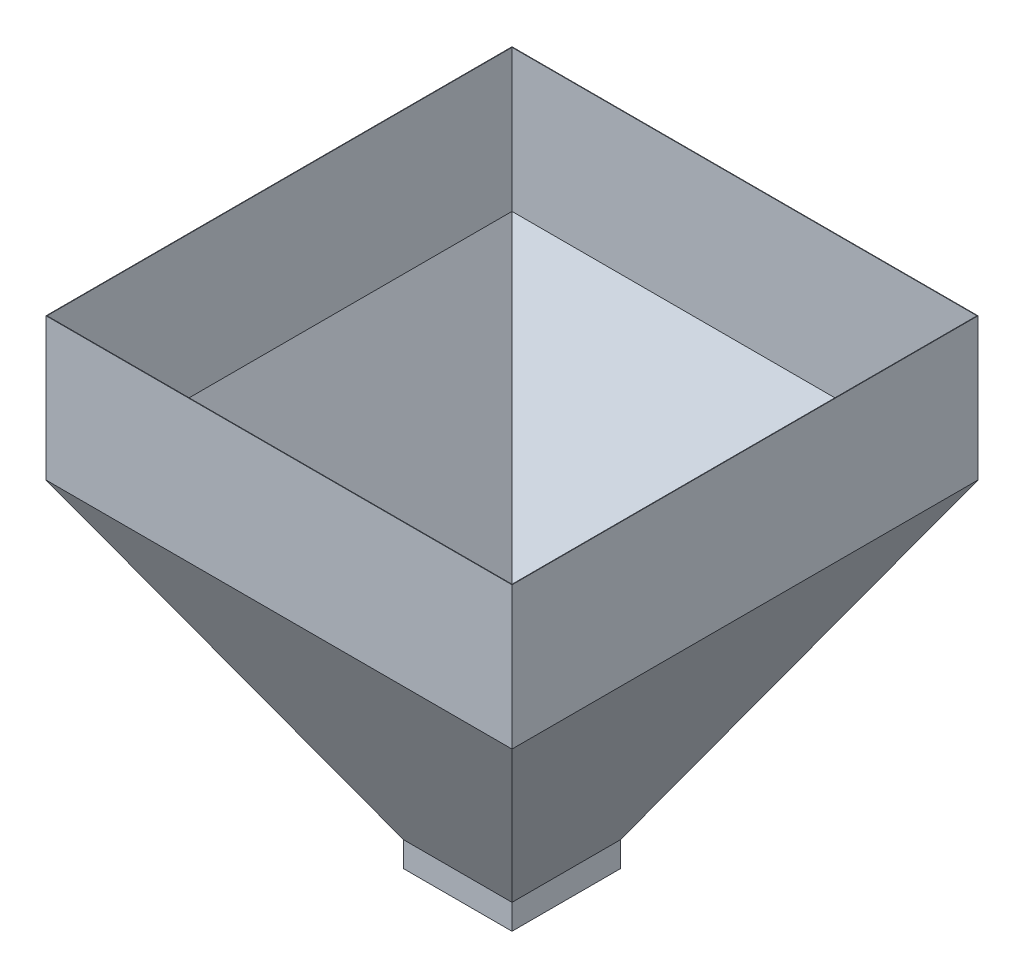
ISO-10303-21;
HEADER;
FILE_DESCRIPTION(('STEP AP214'),'2;1');
FILE_NAME('part.step','',(''),(''),'','','');
FILE_SCHEMA(('AUTOMOTIVE_DESIGN { 1 0 10303 214 1 1 1 1 }'));
ENDSEC;
DATA;
#1=APPLICATION_CONTEXT('core data for automotive mechanical design processes');
#2=APPLICATION_PROTOCOL_DEFINITION('international standard','automotive_design',2000,#1);
#3=PRODUCT_CONTEXT('',#1,'mechanical');
#4=PRODUCT('Part','Part','',(#3));
#5=PRODUCT_RELATED_PRODUCT_CATEGORY('part','',(#4));
#6=PRODUCT_DEFINITION_FORMATION('','',#4);
#7=PRODUCT_DEFINITION_CONTEXT('part definition',#1,'design');
#8=PRODUCT_DEFINITION('design','',#6,#7);
#9=PRODUCT_DEFINITION_SHAPE('','',#8);
#10=(LENGTH_UNIT() NAMED_UNIT(*) SI_UNIT(.MILLI.,.METRE.));
#11=(NAMED_UNIT(*) PLANE_ANGLE_UNIT() SI_UNIT($,.RADIAN.));
#12=(NAMED_UNIT(*) SI_UNIT($,.STERADIAN.) SOLID_ANGLE_UNIT());
#13=UNCERTAINTY_MEASURE_WITH_UNIT(LENGTH_MEASURE(1.E-05),#10,'distance_accuracy_value','');
#14=(GEOMETRIC_REPRESENTATION_CONTEXT(3) GLOBAL_UNCERTAINTY_ASSIGNED_CONTEXT((#13)) GLOBAL_UNIT_ASSIGNED_CONTEXT((#10,
#11,#12)) REPRESENTATION_CONTEXT('',''));
#15=CARTESIAN_POINT('',(0.,0.,0.));
#16=DIRECTION('',(0.,0.,1.));
#17=DIRECTION('',(1.,0.,0.));
#18=AXIS2_PLACEMENT_3D('',#15,#16,#17);
#19=CARTESIAN_POINT('',(-2.0200090675866E-13,-148.510323644844,-258.767988169046));
#20=DIRECTION('',(0.,-0.497762469710978,-0.867313394193372));
#21=DIRECTION('',(0.,0.867313394193372,-0.497762469710978));
#22=AXIS2_PLACEMENT_3D('',#19,#20,#21);
#23=PLANE('',#22);
#24=DIRECTION('',(-0.445610399726942,-0.776442363160582,0.445610399726943));
#25=VECTOR('',#24,1.);
#26=CARTESIAN_POINT('',(344.,0.,-344.));
#27=LINE('',#26,#25);
#28=CARTESIAN_POINT('',(344.,0.,-344.));
#29=VERTEX_POINT('',#28);
#30=CARTESIAN_POINT('',(80.0000000000002,-460.,-80.));
#31=VERTEX_POINT('',#30);
#32=EDGE_CURVE('E276',#29,#31,#27,.T.);
#33=ORIENTED_EDGE('',*,*,#32,.T.);
#34=DIRECTION('',(-1.,0.,0.));
#35=VECTOR('',#34,1.);
#36=CARTESIAN_POINT('',(-80.0000000000001,-460.,-80.));
#37=LINE('',#36,#35);
#38=CARTESIAN_POINT('',(-80.0000000000001,-460.,-80.));
#39=VERTEX_POINT('',#38);
#40=EDGE_CURVE('E12',#31,#39,#37,.T.);
#41=ORIENTED_EDGE('',*,*,#40,.T.);
#42=DIRECTION('',(0.445610399726943,-0.776442363160582,0.445610399726943));
#43=VECTOR('',#42,1.);
#44=CARTESIAN_POINT('',(-344.,0.,-344.));
#45=LINE('',#44,#43);
#46=CARTESIAN_POINT('',(-344.,0.,-344.));
#47=VERTEX_POINT('',#46);
#48=EDGE_CURVE('E338',#47,#39,#45,.T.);
#49=ORIENTED_EDGE('',*,*,#48,.F.);
#50=DIRECTION('',(-1.,0.,0.));
#51=VECTOR('',#50,1.);
#52=CARTESIAN_POINT('',(-344.,0.,-344.));
#53=LINE('',#52,#51);
#54=EDGE_CURVE('E270',#29,#47,#53,.T.);
#55=ORIENTED_EDGE('',*,*,#54,.F.);
#56=EDGE_LOOP('',(#33,#41,#49,#55));
#57=FACE_BOUND('',#56,.T.);
#58=ADVANCED_FACE('F43',(#57),#23,.T.);
#59=CARTESIAN_POINT('',(-258.767988169046,-148.510323644844,2.46889997149473E-13));
#60=DIRECTION('',(-0.867313394193372,-0.497762469710978,0.));
#61=DIRECTION('',(0.497762469710979,-0.867313394193372,0.));
#62=AXIS2_PLACEMENT_3D('',#59,#60,#61);
#63=PLANE('',#62);
#64=ORIENTED_EDGE('',*,*,#48,.T.);
#65=DIRECTION('',(0.,0.,1.));
#66=VECTOR('',#65,1.);
#67=CARTESIAN_POINT('',(-80.0000000000001,-460.,-80.));
#68=LINE('',#67,#66);
#69=CARTESIAN_POINT('',(-80.0000000000001,-460.,80.));
#70=VERTEX_POINT('',#69);
#71=EDGE_CURVE('E48',#39,#70,#68,.T.);
#72=ORIENTED_EDGE('',*,*,#71,.T.);
#73=DIRECTION('',(0.445610399726943,-0.776442363160582,-0.445610399726942));
#74=VECTOR('',#73,1.);
#75=CARTESIAN_POINT('',(-344.,0.,344.));
#76=LINE('',#75,#74);
#77=CARTESIAN_POINT('',(-344.,0.,344.));
#78=VERTEX_POINT('',#77);
#79=EDGE_CURVE('E337',#78,#70,#76,.T.);
#80=ORIENTED_EDGE('',*,*,#79,.F.);
#81=DIRECTION('',(0.,0.,1.));
#82=VECTOR('',#81,1.);
#83=CARTESIAN_POINT('',(-344.,0.,-344.));
#84=LINE('',#83,#82);
#85=EDGE_CURVE('E361',#47,#78,#84,.T.);
#86=ORIENTED_EDGE('',*,*,#85,.F.);
#87=EDGE_LOOP('',(#64,#72,#80,#86));
#88=FACE_BOUND('',#87,.T.);
#89=ADVANCED_FACE('F287',(#88),#63,.T.);
#90=CARTESIAN_POINT('',(258.767988169046,-148.510323644844,0.));
#91=DIRECTION('',(0.867313394193372,-0.497762469710978,0.));
#92=DIRECTION('',(0.497762469710978,0.867313394193372,0.));
#93=AXIS2_PLACEMENT_3D('',#90,#91,#92);
#94=PLANE('',#93);
#95=DIRECTION('',(-0.445610399726942,-0.776442363160582,-0.445610399726943));
#96=VECTOR('',#95,1.);
#97=CARTESIAN_POINT('',(344.,0.,344.));
#98=LINE('',#97,#96);
#99=CARTESIAN_POINT('',(344.,0.,344.));
#100=VERTEX_POINT('',#99);
#101=CARTESIAN_POINT('',(80.0000000000002,-460.,80.));
#102=VERTEX_POINT('',#101);
#103=EDGE_CURVE('E330',#100,#102,#98,.T.);
#104=ORIENTED_EDGE('',*,*,#103,.T.);
#105=DIRECTION('',(0.,0.,-1.));
#106=VECTOR('',#105,1.);
#107=CARTESIAN_POINT('',(80.0000000000001,-460.,-80.0000000000002));
#108=LINE('',#107,#106);
#109=EDGE_CURVE('E308',#102,#31,#108,.T.);
#110=ORIENTED_EDGE('',*,*,#109,.T.);
#111=ORIENTED_EDGE('',*,*,#32,.F.);
#112=DIRECTION('',(0.,0.,-1.));
#113=VECTOR('',#112,1.);
#114=CARTESIAN_POINT('',(344.,0.,-344.));
#115=LINE('',#114,#113);
#116=EDGE_CURVE('E408',#100,#29,#115,.T.);
#117=ORIENTED_EDGE('',*,*,#116,.F.);
#118=EDGE_LOOP('',(#104,#110,#111,#117));
#119=FACE_BOUND('',#118,.T.);
#120=ADVANCED_FACE('F314',(#119),#94,.T.);
#121=CARTESIAN_POINT('',(0.,-148.510323644844,258.767988169046));
#122=DIRECTION('',(0.,-0.497762469710978,0.867313394193372));
#123=DIRECTION('',(0.,-0.867313394193372,-0.497762469710978));
#124=AXIS2_PLACEMENT_3D('',#121,#122,#123);
#125=PLANE('',#124);
#126=ORIENTED_EDGE('',*,*,#79,.T.);
#127=DIRECTION('',(1.,0.,0.));
#128=VECTOR('',#127,1.);
#129=CARTESIAN_POINT('',(-80.,-460.,80.));
#130=LINE('',#129,#128);
#131=EDGE_CURVE('E480',#70,#102,#130,.T.);
#132=ORIENTED_EDGE('',*,*,#131,.T.);
#133=ORIENTED_EDGE('',*,*,#103,.F.);
#134=DIRECTION('',(1.,0.,0.));
#135=VECTOR('',#134,1.);
#136=CARTESIAN_POINT('',(-344.,0.,344.));
#137=LINE('',#136,#135);
#138=EDGE_CURVE('E345',#78,#100,#137,.T.);
#139=ORIENTED_EDGE('',*,*,#138,.F.);
#140=EDGE_LOOP('',(#126,#132,#133,#139));
#141=FACE_BOUND('',#140,.T.);
#142=ADVANCED_FACE('F45',(#141),#125,.T.);
#143=CARTESIAN_POINT('',(-344.,210.,-344.));
#144=DIRECTION('',(1.,0.,0.));
#145=DIRECTION('',(0.,0.,-1.));
#146=AXIS2_PLACEMENT_3D('',#143,#144,#145);
#147=PLANE('',#146);
#148=ORIENTED_EDGE('',*,*,#85,.T.);
#149=DIRECTION('',(0.,-1.,0.));
#150=VECTOR('',#149,1.);
#151=CARTESIAN_POINT('',(-344.,210.,344.));
#152=LINE('',#151,#150);
#153=CARTESIAN_POINT('',(-344.,210.,344.));
#154=VERTEX_POINT('',#153);
#155=EDGE_CURVE('E412',#154,#78,#152,.T.);
#156=ORIENTED_EDGE('',*,*,#155,.F.);
#157=DIRECTION('',(0.,0.,1.));
#158=VECTOR('',#157,1.);
#159=CARTESIAN_POINT('',(-344.,210.,-344.));
#160=LINE('',#159,#158);
#161=CARTESIAN_POINT('',(-344.,210.,-344.));
#162=VERTEX_POINT('',#161);
#163=EDGE_CURVE('E243',#162,#154,#160,.T.);
#164=ORIENTED_EDGE('',*,*,#163,.F.);
#165=DIRECTION('',(0.,-1.,0.));
#166=VECTOR('',#165,1.);
#167=CARTESIAN_POINT('',(-344.,210.,-344.));
#168=LINE('',#167,#166);
#169=EDGE_CURVE('E263',#162,#47,#168,.T.);
#170=ORIENTED_EDGE('',*,*,#169,.T.);
#171=EDGE_LOOP('',(#148,#156,#164,#170));
#172=FACE_BOUND('',#171,.T.);
#173=ADVANCED_FACE('F288',(#172),#147,.F.);
#174=CARTESIAN_POINT('',(-344.,210.,344.));
#175=DIRECTION('',(0.,0.,-1.));
#176=DIRECTION('',(-1.,0.,0.));
#177=AXIS2_PLACEMENT_3D('',#174,#175,#176);
#178=PLANE('',#177);
#179=ORIENTED_EDGE('',*,*,#138,.T.);
#180=DIRECTION('',(0.,-1.,0.));
#181=VECTOR('',#180,1.);
#182=CARTESIAN_POINT('',(344.,210.,344.));
#183=LINE('',#182,#181);
#184=CARTESIAN_POINT('',(344.,210.,344.));
#185=VERTEX_POINT('',#184);
#186=EDGE_CURVE('E390',#185,#100,#183,.T.);
#187=ORIENTED_EDGE('',*,*,#186,.F.);
#188=DIRECTION('',(1.,0.,0.));
#189=VECTOR('',#188,1.);
#190=CARTESIAN_POINT('',(-344.,210.,344.));
#191=LINE('',#190,#189);
#192=EDGE_CURVE('E257',#154,#185,#191,.T.);
#193=ORIENTED_EDGE('',*,*,#192,.F.);
#194=ORIENTED_EDGE('',*,*,#155,.T.);
#195=EDGE_LOOP('',(#179,#187,#193,#194));
#196=FACE_BOUND('',#195,.T.);
#197=ADVANCED_FACE('F427',(#196),#178,.F.);
#198=CARTESIAN_POINT('',(344.,210.,-344.));
#199=DIRECTION('',(-1.,0.,0.));
#200=DIRECTION('',(0.,0.,1.));
#201=AXIS2_PLACEMENT_3D('',#198,#199,#200);
#202=PLANE('',#201);
#203=ORIENTED_EDGE('',*,*,#116,.T.);
#204=DIRECTION('',(0.,-1.,0.));
#205=VECTOR('',#204,1.);
#206=CARTESIAN_POINT('',(344.,210.,-344.));
#207=LINE('',#206,#205);
#208=CARTESIAN_POINT('',(344.,210.,-344.));
#209=VERTEX_POINT('',#208);
#210=EDGE_CURVE('E385',#209,#29,#207,.T.);
#211=ORIENTED_EDGE('',*,*,#210,.F.);
#212=DIRECTION('',(0.,0.,-1.));
#213=VECTOR('',#212,1.);
#214=CARTESIAN_POINT('',(344.,210.,-344.));
#215=LINE('',#214,#213);
#216=EDGE_CURVE('E259',#185,#209,#215,.T.);
#217=ORIENTED_EDGE('',*,*,#216,.F.);
#218=ORIENTED_EDGE('',*,*,#186,.T.);
#219=EDGE_LOOP('',(#203,#211,#217,#218));
#220=FACE_BOUND('',#219,.T.);
#221=ADVANCED_FACE('F428',(#220),#202,.F.);
#222=CARTESIAN_POINT('',(-344.,210.,-344.));
#223=DIRECTION('',(0.,0.,1.));
#224=DIRECTION('',(1.,0.,0.));
#225=AXIS2_PLACEMENT_3D('',#222,#223,#224);
#226=PLANE('',#225);
#227=ORIENTED_EDGE('',*,*,#54,.T.);
#228=ORIENTED_EDGE('',*,*,#169,.F.);
#229=DIRECTION('',(-1.,0.,0.));
#230=VECTOR('',#229,1.);
#231=CARTESIAN_POINT('',(-344.,210.,-344.));
#232=LINE('',#231,#230);
#233=EDGE_CURVE('E261',#209,#162,#232,.T.);
#234=ORIENTED_EDGE('',*,*,#233,.F.);
#235=ORIENTED_EDGE('',*,*,#210,.T.);
#236=EDGE_LOOP('',(#227,#228,#234,#235));
#237=FACE_BOUND('',#236,.T.);
#238=ADVANCED_FACE('F381',(#237),#226,.F.);
#239=CARTESIAN_POINT('',(0.,210.,0.));
#240=DIRECTION('',(0.,1.,0.));
#241=DIRECTION('',(0.,0.,1.));
#242=AXIS2_PLACEMENT_3D('',#239,#240,#241);
#243=PLANE('',#242);
#244=DIRECTION('',(0.,0.,1.));
#245=VECTOR('',#244,1.);
#246=CARTESIAN_POINT('',(-343.24,210.,-344.));
#247=LINE('',#246,#245);
#248=CARTESIAN_POINT('',(-343.24,210.,-343.24));
#249=VERTEX_POINT('',#248);
#250=CARTESIAN_POINT('',(-343.24,210.,343.24));
#251=VERTEX_POINT('',#250);
#252=EDGE_CURVE('E250',#249,#251,#247,.T.);
#253=ORIENTED_EDGE('',*,*,#252,.F.);
#254=DIRECTION('',(-1.,0.,0.));
#255=VECTOR('',#254,1.);
#256=CARTESIAN_POINT('',(-344.,210.,-343.24));
#257=LINE('',#256,#255);
#258=CARTESIAN_POINT('',(343.24,210.,-343.24));
#259=VERTEX_POINT('',#258);
#260=EDGE_CURVE('E238',#259,#249,#257,.T.);
#261=ORIENTED_EDGE('',*,*,#260,.F.);
#262=DIRECTION('',(0.,0.,-1.));
#263=VECTOR('',#262,1.);
#264=CARTESIAN_POINT('',(343.24,210.,-344.));
#265=LINE('',#264,#263);
#266=CARTESIAN_POINT('',(343.24,210.,343.24));
#267=VERTEX_POINT('',#266);
#268=EDGE_CURVE('E249',#267,#259,#265,.T.);
#269=ORIENTED_EDGE('',*,*,#268,.F.);
#270=DIRECTION('',(1.,0.,0.));
#271=VECTOR('',#270,1.);
#272=CARTESIAN_POINT('',(-344.,210.,343.24));
#273=LINE('',#272,#271);
#274=EDGE_CURVE('E247',#251,#267,#273,.T.);
#275=ORIENTED_EDGE('',*,*,#274,.F.);
#276=EDGE_LOOP('',(#253,#261,#269,#275));
#277=FACE_BOUND('',#276,.T.);
#278=ORIENTED_EDGE('',*,*,#163,.T.);
#279=ORIENTED_EDGE('',*,*,#192,.T.);
#280=ORIENTED_EDGE('',*,*,#216,.T.);
#281=ORIENTED_EDGE('',*,*,#233,.T.);
#282=EDGE_LOOP('',(#278,#279,#280,#281));
#283=FACE_BOUND('',#282,.T.);
#284=ADVANCED_FACE('F430',(#277,#283),#243,.T.);
#285=CARTESIAN_POINT('',(-2.01486351032829E-13,-148.132024167863,-258.108829989459));
#286=DIRECTION('',(0.,-0.497762469710978,-0.867313394193372));
#287=DIRECTION('',(0.,0.867313394193372,-0.497762469710978));
#288=AXIS2_PLACEMENT_3D('',#285,#286,#287);
#289=PLANE('',#288);
#290=DIRECTION('',(-0.445610399726942,-0.776442363160582,0.445610399726943));
#291=VECTOR('',#290,1.);
#292=CARTESIAN_POINT('',(206.85651365477,-237.435302629822,-206.85651365477));
#293=LINE('',#292,#291);
#294=CARTESIAN_POINT('',(343.24,0.202590244442686,-343.24));
#295=VERTEX_POINT('',#294);
#296=CARTESIAN_POINT('',(79.1237308162331,-460.,-79.1237308162333));
#297=VERTEX_POINT('',#296);
#298=EDGE_CURVE('E207',#295,#297,#293,.T.);
#299=ORIENTED_EDGE('',*,*,#298,.F.);
#300=DIRECTION('',(-1.,0.,0.));
#301=VECTOR('',#300,1.);
#302=CARTESIAN_POINT('',(0.,0.202590244442941,-343.24));
#303=LINE('',#302,#301);
#304=CARTESIAN_POINT('',(-343.240000000001,0.202590244442901,-343.24));
#305=VERTEX_POINT('',#304);
#306=EDGE_CURVE('E211',#295,#305,#303,.T.);
#307=ORIENTED_EDGE('',*,*,#306,.T.);
#308=DIRECTION('',(0.445610399726943,-0.776442363160582,0.445610399726942));
#309=VECTOR('',#308,1.);
#310=CARTESIAN_POINT('',(-206.85651365477,-237.435302629823,-206.85651365477));
#311=LINE('',#310,#309);
#312=CARTESIAN_POINT('',(-79.1237308162331,-460.,-79.1237308162331));
#313=VERTEX_POINT('',#312);
#314=EDGE_CURVE('E210',#305,#313,#311,.T.);
#315=ORIENTED_EDGE('',*,*,#314,.T.);
#316=DIRECTION('',(-1.,0.,0.));
#317=VECTOR('',#316,1.);
#318=CARTESIAN_POINT('',(0.,-460.,-79.1237308162332));
#319=LINE('',#318,#317);
#320=EDGE_CURVE('E240',#297,#313,#319,.T.);
#321=ORIENTED_EDGE('',*,*,#320,.F.);
#322=EDGE_LOOP('',(#299,#307,#315,#321));
#323=FACE_BOUND('',#322,.T.);
#324=ADVANCED_FACE('F432',(#323),#289,.F.);
#325=CARTESIAN_POINT('',(-258.108829989459,-148.132024167864,2.46261095706792E-13));
#326=DIRECTION('',(-0.867313394193372,-0.497762469710978,0.));
#327=DIRECTION('',(0.497762469710979,-0.867313394193372,0.));
#328=AXIS2_PLACEMENT_3D('',#325,#326,#327);
#329=PLANE('',#328);
#330=ORIENTED_EDGE('',*,*,#314,.F.);
#331=DIRECTION('',(0.,0.,1.));
#332=VECTOR('',#331,1.);
#333=CARTESIAN_POINT('',(-343.24,0.202590244442968,0.));
#334=LINE('',#333,#332);
#335=CARTESIAN_POINT('',(-343.24,0.202590244442962,343.24));
#336=VERTEX_POINT('',#335);
#337=EDGE_CURVE('E216',#305,#336,#334,.T.);
#338=ORIENTED_EDGE('',*,*,#337,.T.);
#339=DIRECTION('',(0.445610399726942,-0.776442363160582,-0.445610399726942));
#340=VECTOR('',#339,1.);
#341=CARTESIAN_POINT('',(-206.85651365477,-237.435302629822,206.85651365477));
#342=LINE('',#341,#340);
#343=CARTESIAN_POINT('',(-79.1237308162331,-460.,79.1237308162331));
#344=VERTEX_POINT('',#343);
#345=EDGE_CURVE('E217',#336,#344,#342,.T.);
#346=ORIENTED_EDGE('',*,*,#345,.T.);
#347=DIRECTION('',(0.,0.,1.));
#348=VECTOR('',#347,1.);
#349=CARTESIAN_POINT('',(-79.1237308162331,-460.,0.));
#350=LINE('',#349,#348);
#351=EDGE_CURVE('E61',#313,#344,#350,.T.);
#352=ORIENTED_EDGE('',*,*,#351,.F.);
#353=EDGE_LOOP('',(#330,#338,#346,#352));
#354=FACE_BOUND('',#353,.T.);
#355=ADVANCED_FACE('F439',(#354),#329,.F.);
#356=CARTESIAN_POINT('',(258.108829989459,-148.132024167863,0.));
#357=DIRECTION('',(0.867313394193372,-0.497762469710978,0.));
#358=DIRECTION('',(0.497762469710978,0.867313394193372,0.));
#359=AXIS2_PLACEMENT_3D('',#356,#357,#358);
#360=PLANE('',#359);
#361=DIRECTION('',(-0.445610399726942,-0.776442363160582,-0.445610399726942));
#362=VECTOR('',#361,1.);
#363=CARTESIAN_POINT('',(206.85651365477,-237.435302629822,206.85651365477));
#364=LINE('',#363,#362);
#365=CARTESIAN_POINT('',(343.24,0.202590244442441,343.24));
#366=VERTEX_POINT('',#365);
#367=CARTESIAN_POINT('',(79.1237308162331,-460.,79.1237308162331));
#368=VERTEX_POINT('',#367);
#369=EDGE_CURVE('E213',#366,#368,#364,.T.);
#370=ORIENTED_EDGE('',*,*,#369,.F.);
#371=DIRECTION('',(0.,0.,-1.));
#372=VECTOR('',#371,1.);
#373=CARTESIAN_POINT('',(343.24,0.202590244442691,0.));
#374=LINE('',#373,#372);
#375=EDGE_CURVE('E226',#366,#295,#374,.T.);
#376=ORIENTED_EDGE('',*,*,#375,.T.);
#377=ORIENTED_EDGE('',*,*,#298,.T.);
#378=DIRECTION('',(0.,0.,-1.));
#379=VECTOR('',#378,1.);
#380=CARTESIAN_POINT('',(79.1237308162331,-460.,0.));
#381=LINE('',#380,#379);
#382=EDGE_CURVE('E219',#368,#297,#381,.T.);
#383=ORIENTED_EDGE('',*,*,#382,.F.);
#384=EDGE_LOOP('',(#370,#376,#377,#383));
#385=FACE_BOUND('',#384,.T.);
#386=ADVANCED_FACE('F569',(#385),#360,.F.);
#387=CARTESIAN_POINT('',(0.,-148.132024167863,258.108829989459));
#388=DIRECTION('',(0.,-0.497762469710978,0.867313394193372));
#389=DIRECTION('',(0.,-0.867313394193372,-0.497762469710978));
#390=AXIS2_PLACEMENT_3D('',#387,#388,#389);
#391=PLANE('',#390);
#392=ORIENTED_EDGE('',*,*,#345,.F.);
#393=DIRECTION('',(1.,0.,0.));
#394=VECTOR('',#393,1.);
#395=CARTESIAN_POINT('',(0.,0.202590244442385,343.24));
#396=LINE('',#395,#394);
#397=EDGE_CURVE('E222',#336,#366,#396,.T.);
#398=ORIENTED_EDGE('',*,*,#397,.T.);
#399=ORIENTED_EDGE('',*,*,#369,.T.);
#400=DIRECTION('',(1.,0.,0.));
#401=VECTOR('',#400,1.);
#402=CARTESIAN_POINT('',(0.,-460.,79.1237308162331));
#403=LINE('',#402,#401);
#404=EDGE_CURVE('E180',#344,#368,#403,.T.);
#405=ORIENTED_EDGE('',*,*,#404,.F.);
#406=EDGE_LOOP('',(#392,#398,#399,#405));
#407=FACE_BOUND('',#406,.T.);
#408=ADVANCED_FACE('F585',(#407),#391,.F.);
#409=CARTESIAN_POINT('',(-343.24,210.,-344.));
#410=DIRECTION('',(1.,0.,0.));
#411=DIRECTION('',(0.,0.,-1.));
#412=AXIS2_PLACEMENT_3D('',#409,#410,#411);
#413=PLANE('',#412);
#414=ORIENTED_EDGE('',*,*,#337,.F.);
#415=DIRECTION('',(0.,-1.,0.));
#416=VECTOR('',#415,1.);
#417=CARTESIAN_POINT('',(-343.24,210.,-343.24));
#418=LINE('',#417,#416);
#419=EDGE_CURVE('E235',#249,#305,#418,.T.);
#420=ORIENTED_EDGE('',*,*,#419,.F.);
#421=ORIENTED_EDGE('',*,*,#252,.T.);
#422=DIRECTION('',(0.,-1.,0.));
#423=VECTOR('',#422,1.);
#424=CARTESIAN_POINT('',(-343.24,210.,343.24));
#425=LINE('',#424,#423);
#426=EDGE_CURVE('E229',#251,#336,#425,.T.);
#427=ORIENTED_EDGE('',*,*,#426,.T.);
#428=EDGE_LOOP('',(#414,#420,#421,#427));
#429=FACE_BOUND('',#428,.T.);
#430=ADVANCED_FACE('F579',(#429),#413,.T.);
#431=CARTESIAN_POINT('',(-344.,210.,343.24));
#432=DIRECTION('',(0.,0.,-1.));
#433=DIRECTION('',(-1.,0.,0.));
#434=AXIS2_PLACEMENT_3D('',#431,#432,#433);
#435=PLANE('',#434);
#436=ORIENTED_EDGE('',*,*,#397,.F.);
#437=ORIENTED_EDGE('',*,*,#426,.F.);
#438=ORIENTED_EDGE('',*,*,#274,.T.);
#439=DIRECTION('',(0.,-1.,0.));
#440=VECTOR('',#439,1.);
#441=CARTESIAN_POINT('',(343.24,210.,343.24));
#442=LINE('',#441,#440);
#443=EDGE_CURVE('E230',#267,#366,#442,.T.);
#444=ORIENTED_EDGE('',*,*,#443,.T.);
#445=EDGE_LOOP('',(#436,#437,#438,#444));
#446=FACE_BOUND('',#445,.T.);
#447=ADVANCED_FACE('F593',(#446),#435,.T.);
#448=CARTESIAN_POINT('',(343.24,210.,-344.));
#449=DIRECTION('',(-1.,0.,0.));
#450=DIRECTION('',(0.,0.,1.));
#451=AXIS2_PLACEMENT_3D('',#448,#449,#450);
#452=PLANE('',#451);
#453=ORIENTED_EDGE('',*,*,#375,.F.);
#454=ORIENTED_EDGE('',*,*,#443,.F.);
#455=ORIENTED_EDGE('',*,*,#268,.T.);
#456=DIRECTION('',(0.,-1.,0.));
#457=VECTOR('',#456,1.);
#458=CARTESIAN_POINT('',(343.24,210.,-343.24));
#459=LINE('',#458,#457);
#460=EDGE_CURVE('E69',#259,#295,#459,.T.);
#461=ORIENTED_EDGE('',*,*,#460,.T.);
#462=EDGE_LOOP('',(#453,#454,#455,#461));
#463=FACE_BOUND('',#462,.T.);
#464=ADVANCED_FACE('F573',(#463),#452,.T.);
#465=CARTESIAN_POINT('',(-344.,210.,-343.24));
#466=DIRECTION('',(0.,0.,1.));
#467=DIRECTION('',(1.,0.,0.));
#468=AXIS2_PLACEMENT_3D('',#465,#466,#467);
#469=PLANE('',#468);
#470=ORIENTED_EDGE('',*,*,#306,.F.);
#471=ORIENTED_EDGE('',*,*,#460,.F.);
#472=ORIENTED_EDGE('',*,*,#260,.T.);
#473=ORIENTED_EDGE('',*,*,#419,.T.);
#474=EDGE_LOOP('',(#470,#471,#472,#473));
#475=FACE_BOUND('',#474,.T.);
#476=ADVANCED_FACE('F445',(#475),#469,.T.);
#477=CARTESIAN_POINT('',(0.,-497.,0.));
#478=DIRECTION('',(0.,1.,0.));
#479=DIRECTION('',(0.,0.,1.));
#480=AXIS2_PLACEMENT_3D('',#477,#478,#479);
#481=PLANE('',#480);
#482=DIRECTION('',(0.,0.,-1.));
#483=VECTOR('',#482,1.);
#484=CARTESIAN_POINT('',(-80.0000000000001,-497.,-80.));
#485=LINE('',#484,#483);
#486=CARTESIAN_POINT('',(-80.0000000000001,-497.,80.));
#487=VERTEX_POINT('',#486);
#488=CARTESIAN_POINT('',(-80.0000000000001,-497.,-80.));
#489=VERTEX_POINT('',#488);
#490=EDGE_CURVE('E181',#487,#489,#485,.T.);
#491=ORIENTED_EDGE('',*,*,#490,.T.);
#492=DIRECTION('',(1.,0.,0.));
#493=VECTOR('',#492,1.);
#494=CARTESIAN_POINT('',(-80.0000000000001,-497.,-80.));
#495=LINE('',#494,#493);
#496=CARTESIAN_POINT('',(80.0000000000002,-497.,-80.));
#497=VERTEX_POINT('',#496);
#498=EDGE_CURVE('E200',#489,#497,#495,.T.);
#499=ORIENTED_EDGE('',*,*,#498,.T.);
#500=DIRECTION('',(0.,0.,1.));
#501=VECTOR('',#500,1.);
#502=CARTESIAN_POINT('',(80.0000000000002,-497.,-80.));
#503=LINE('',#502,#501);
#504=CARTESIAN_POINT('',(80.0000000000002,-497.,80.));
#505=VERTEX_POINT('',#504);
#506=EDGE_CURVE('E202',#497,#505,#503,.T.);
#507=ORIENTED_EDGE('',*,*,#506,.T.);
#508=DIRECTION('',(-1.,0.,0.));
#509=VECTOR('',#508,1.);
#510=CARTESIAN_POINT('',(-80.0000000000001,-497.,80.));
#511=LINE('',#510,#509);
#512=EDGE_CURVE('E204',#505,#487,#511,.T.);
#513=ORIENTED_EDGE('',*,*,#512,.T.);
#514=EDGE_LOOP('',(#491,#499,#507,#513));
#515=FACE_BOUND('',#514,.T.);
#516=DIRECTION('',(0.,0.,1.));
#517=VECTOR('',#516,1.);
#518=CARTESIAN_POINT('',(79.1237308162331,-497.,79.1237308162331));
#519=LINE('',#518,#517);
#520=CARTESIAN_POINT('',(79.1237308162331,-497.,-79.1237308162331));
#521=VERTEX_POINT('',#520);
#522=CARTESIAN_POINT('',(79.1237308162331,-497.,79.1237308162331));
#523=VERTEX_POINT('',#522);
#524=EDGE_CURVE('E163',#521,#523,#519,.T.);
#525=ORIENTED_EDGE('',*,*,#524,.F.);
#526=DIRECTION('',(1.,0.,0.));
#527=VECTOR('',#526,1.);
#528=CARTESIAN_POINT('',(79.1237308162331,-497.,-79.1237308162331));
#529=LINE('',#528,#527);
#530=CARTESIAN_POINT('',(-79.1237308162331,-497.,-79.1237308162331));
#531=VERTEX_POINT('',#530);
#532=EDGE_CURVE('E189',#531,#521,#529,.T.);
#533=ORIENTED_EDGE('',*,*,#532,.F.);
#534=DIRECTION('',(0.,0.,-1.));
#535=VECTOR('',#534,1.);
#536=CARTESIAN_POINT('',(-79.1237308162331,-497.,79.1237308162331));
#537=LINE('',#536,#535);
#538=CARTESIAN_POINT('',(-79.1237308162331,-497.,79.1237308162331));
#539=VERTEX_POINT('',#538);
#540=EDGE_CURVE('E187',#539,#531,#537,.T.);
#541=ORIENTED_EDGE('',*,*,#540,.F.);
#542=DIRECTION('',(-1.,0.,0.));
#543=VECTOR('',#542,1.);
#544=CARTESIAN_POINT('',(79.1237308162331,-497.,79.1237308162331));
#545=LINE('',#544,#543);
#546=EDGE_CURVE('E173',#523,#539,#545,.T.);
#547=ORIENTED_EDGE('',*,*,#546,.F.);
#548=EDGE_LOOP('',(#525,#533,#541,#547));
#549=FACE_BOUND('',#548,.T.);
#550=ADVANCED_FACE('F185',(#515,#549),#481,.F.);
#551=CARTESIAN_POINT('',(-80.0000000000001,-497.,-80.));
#552=DIRECTION('',(1.,0.,0.));
#553=DIRECTION('',(0.,0.,-1.));
#554=AXIS2_PLACEMENT_3D('',#551,#552,#553);
#555=PLANE('',#554);
#556=ORIENTED_EDGE('',*,*,#71,.F.);
#557=DIRECTION('',(0.,1.,0.));
#558=VECTOR('',#557,1.);
#559=CARTESIAN_POINT('',(-80.0000000000001,-497.,-80.));
#560=LINE('',#559,#558);
#561=EDGE_CURVE('E254',#489,#39,#560,.T.);
#562=ORIENTED_EDGE('',*,*,#561,.F.);
#563=ORIENTED_EDGE('',*,*,#490,.F.);
#564=DIRECTION('',(0.,1.,0.));
#565=VECTOR('',#564,1.);
#566=CARTESIAN_POINT('',(-80.0000000000001,-497.,80.));
#567=LINE('',#566,#565);
#568=EDGE_CURVE('E206',#487,#70,#567,.T.);
#569=ORIENTED_EDGE('',*,*,#568,.T.);
#570=EDGE_LOOP('',(#556,#562,#563,#569));
#571=FACE_BOUND('',#570,.T.);
#572=ADVANCED_FACE('F521',(#571),#555,.F.);
#573=CARTESIAN_POINT('',(-80.0000000000001,-497.,-80.));
#574=DIRECTION('',(0.,0.,1.));
#575=DIRECTION('',(1.,0.,0.));
#576=AXIS2_PLACEMENT_3D('',#573,#574,#575);
#577=PLANE('',#576);
#578=ORIENTED_EDGE('',*,*,#40,.F.);
#579=DIRECTION('',(0.,1.,0.));
#580=VECTOR('',#579,1.);
#581=CARTESIAN_POINT('',(80.0000000000002,-497.,-80.));
#582=LINE('',#581,#580);
#583=EDGE_CURVE('E498',#497,#31,#582,.T.);
#584=ORIENTED_EDGE('',*,*,#583,.F.);
#585=ORIENTED_EDGE('',*,*,#498,.F.);
#586=ORIENTED_EDGE('',*,*,#561,.T.);
#587=EDGE_LOOP('',(#578,#584,#585,#586));
#588=FACE_BOUND('',#587,.T.);
#589=ADVANCED_FACE('F510',(#588),#577,.F.);
#590=CARTESIAN_POINT('',(80.0000000000002,-497.,-80.));
#591=DIRECTION('',(-1.,0.,0.));
#592=DIRECTION('',(0.,0.,1.));
#593=AXIS2_PLACEMENT_3D('',#590,#591,#592);
#594=PLANE('',#593);
#595=ORIENTED_EDGE('',*,*,#109,.F.);
#596=DIRECTION('',(0.,1.,0.));
#597=VECTOR('',#596,1.);
#598=CARTESIAN_POINT('',(80.0000000000002,-497.,80.));
#599=LINE('',#598,#597);
#600=EDGE_CURVE('E538',#505,#102,#599,.T.);
#601=ORIENTED_EDGE('',*,*,#600,.F.);
#602=ORIENTED_EDGE('',*,*,#506,.F.);
#603=ORIENTED_EDGE('',*,*,#583,.T.);
#604=EDGE_LOOP('',(#595,#601,#602,#603));
#605=FACE_BOUND('',#604,.T.);
#606=ADVANCED_FACE('F520',(#605),#594,.F.);
#607=CARTESIAN_POINT('',(-80.0000000000001,-497.,80.));
#608=DIRECTION('',(0.,0.,-1.));
#609=DIRECTION('',(-1.,0.,0.));
#610=AXIS2_PLACEMENT_3D('',#607,#608,#609);
#611=PLANE('',#610);
#612=ORIENTED_EDGE('',*,*,#131,.F.);
#613=ORIENTED_EDGE('',*,*,#568,.F.);
#614=ORIENTED_EDGE('',*,*,#512,.F.);
#615=ORIENTED_EDGE('',*,*,#600,.T.);
#616=EDGE_LOOP('',(#612,#613,#614,#615));
#617=FACE_BOUND('',#616,.T.);
#618=ADVANCED_FACE('F542',(#617),#611,.F.);
#619=CARTESIAN_POINT('',(79.1237308162331,-497.,79.1237308162331));
#620=DIRECTION('',(-1.,0.,0.));
#621=DIRECTION('',(0.,0.,1.));
#622=AXIS2_PLACEMENT_3D('',#619,#620,#621);
#623=PLANE('',#622);
#624=ORIENTED_EDGE('',*,*,#382,.T.);
#625=DIRECTION('',(0.,1.,0.));
#626=VECTOR('',#625,1.);
#627=CARTESIAN_POINT('',(79.1237308162331,-497.,-79.1237308162331));
#628=LINE('',#627,#626);
#629=EDGE_CURVE('E169',#521,#297,#628,.T.);
#630=ORIENTED_EDGE('',*,*,#629,.F.);
#631=ORIENTED_EDGE('',*,*,#524,.T.);
#632=DIRECTION('',(0.,1.,0.));
#633=VECTOR('',#632,1.);
#634=CARTESIAN_POINT('',(79.1237308162331,-497.,79.1237308162331));
#635=LINE('',#634,#633);
#636=EDGE_CURVE('E167',#523,#368,#635,.T.);
#637=ORIENTED_EDGE('',*,*,#636,.T.);
#638=EDGE_LOOP('',(#624,#630,#631,#637));
#639=FACE_BOUND('',#638,.T.);
#640=ADVANCED_FACE('F166',(#639),#623,.T.);
#641=CARTESIAN_POINT('',(79.1237308162331,-497.,79.1237308162331));
#642=DIRECTION('',(0.,0.,-1.));
#643=DIRECTION('',(-1.,0.,0.));
#644=AXIS2_PLACEMENT_3D('',#641,#642,#643);
#645=PLANE('',#644);
#646=ORIENTED_EDGE('',*,*,#404,.T.);
#647=ORIENTED_EDGE('',*,*,#636,.F.);
#648=ORIENTED_EDGE('',*,*,#546,.T.);
#649=DIRECTION('',(0.,1.,0.));
#650=VECTOR('',#649,1.);
#651=CARTESIAN_POINT('',(-79.1237308162331,-497.,79.1237308162331));
#652=LINE('',#651,#650);
#653=EDGE_CURVE('E182',#539,#344,#652,.T.);
#654=ORIENTED_EDGE('',*,*,#653,.T.);
#655=EDGE_LOOP('',(#646,#647,#648,#654));
#656=FACE_BOUND('',#655,.T.);
#657=ADVANCED_FACE('F177',(#656),#645,.T.);
#658=CARTESIAN_POINT('',(-79.1237308162331,-497.,79.1237308162331));
#659=DIRECTION('',(1.,0.,0.));
#660=DIRECTION('',(0.,0.,-1.));
#661=AXIS2_PLACEMENT_3D('',#658,#659,#660);
#662=PLANE('',#661);
#663=ORIENTED_EDGE('',*,*,#351,.T.);
#664=ORIENTED_EDGE('',*,*,#653,.F.);
#665=ORIENTED_EDGE('',*,*,#540,.T.);
#666=DIRECTION('',(0.,1.,0.));
#667=VECTOR('',#666,1.);
#668=CARTESIAN_POINT('',(-79.1237308162331,-497.,-79.1237308162331));
#669=LINE('',#668,#667);
#670=EDGE_CURVE('E194',#531,#313,#669,.T.);
#671=ORIENTED_EDGE('',*,*,#670,.T.);
#672=EDGE_LOOP('',(#663,#664,#665,#671));
#673=FACE_BOUND('',#672,.T.);
#674=ADVANCED_FACE('F558',(#673),#662,.T.);
#675=CARTESIAN_POINT('',(79.1237308162331,-497.,-79.1237308162331));
#676=DIRECTION('',(0.,0.,1.));
#677=DIRECTION('',(1.,0.,0.));
#678=AXIS2_PLACEMENT_3D('',#675,#676,#677);
#679=PLANE('',#678);
#680=ORIENTED_EDGE('',*,*,#320,.T.);
#681=ORIENTED_EDGE('',*,*,#670,.F.);
#682=ORIENTED_EDGE('',*,*,#532,.T.);
#683=ORIENTED_EDGE('',*,*,#629,.T.);
#684=EDGE_LOOP('',(#680,#681,#682,#683));
#685=FACE_BOUND('',#684,.T.);
#686=ADVANCED_FACE('F561',(#685),#679,.T.);
#687=CLOSED_SHELL('',(#58,#89,#120,#142,#173,#197,#221,#238,#284,#324,#355,#386,#408,#430,#447,
#464,#476,#550,#572,#589,#606,#618,#640,#657,#674,#686));
#688=MANIFOLD_SOLID_BREP('B2',#687);
#689=ADVANCED_BREP_SHAPE_REPRESENTATION('',(#18,#688),#14);
#690=SHAPE_DEFINITION_REPRESENTATION(#9,#689);
ENDSEC;
END-ISO-10303-21;
